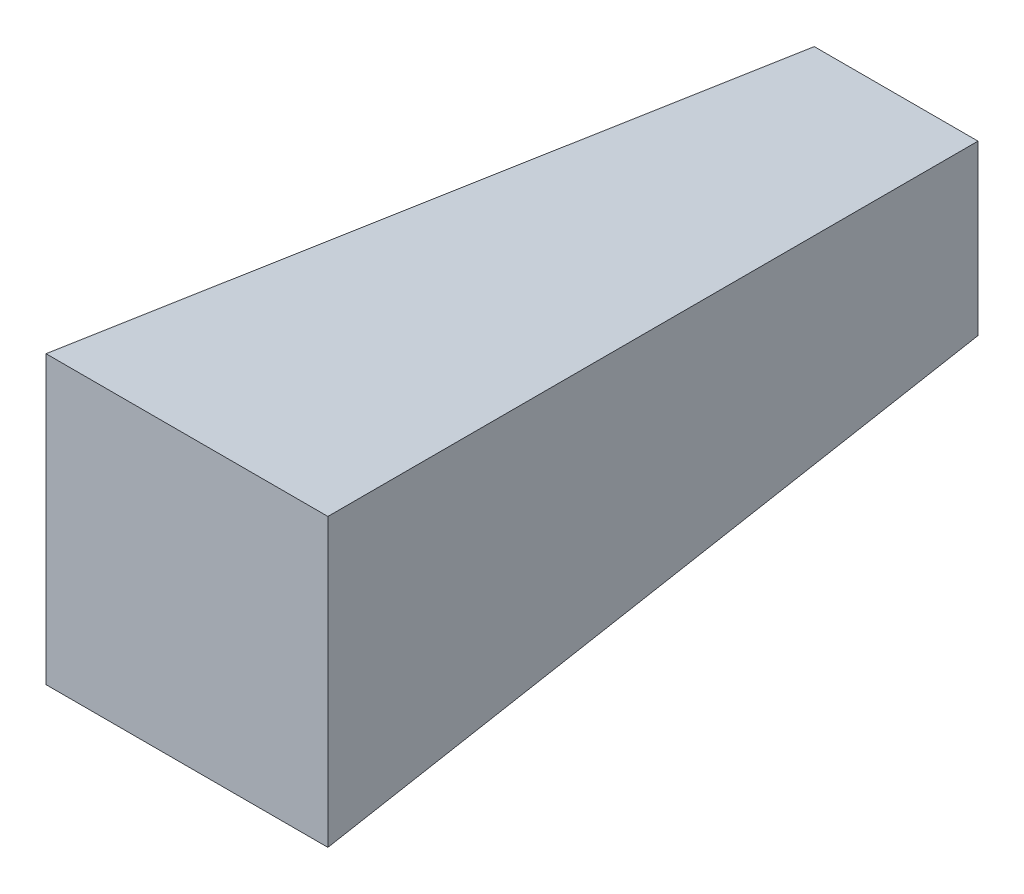
ISO-10303-21;
HEADER;
FILE_DESCRIPTION(('STEP AP214'),'2;1');
FILE_NAME('part.step','',(''),(''),'','','');
FILE_SCHEMA(('AUTOMOTIVE_DESIGN { 1 0 10303 214 1 1 1 1 }'));
ENDSEC;
DATA;
#1=APPLICATION_CONTEXT('core data for automotive mechanical design processes');
#2=APPLICATION_PROTOCOL_DEFINITION('international standard','automotive_design',2000,#1);
#3=PRODUCT_CONTEXT('',#1,'mechanical');
#4=PRODUCT('Part','Part','',(#3));
#5=PRODUCT_RELATED_PRODUCT_CATEGORY('part','',(#4));
#6=PRODUCT_DEFINITION_FORMATION('','',#4);
#7=PRODUCT_DEFINITION_CONTEXT('part definition',#1,'design');
#8=PRODUCT_DEFINITION('design','',#6,#7);
#9=PRODUCT_DEFINITION_SHAPE('','',#8);
#10=(LENGTH_UNIT() NAMED_UNIT(*) SI_UNIT(.MILLI.,.METRE.));
#11=(NAMED_UNIT(*) PLANE_ANGLE_UNIT() SI_UNIT($,.RADIAN.));
#12=(NAMED_UNIT(*) SI_UNIT($,.STERADIAN.) SOLID_ANGLE_UNIT());
#13=UNCERTAINTY_MEASURE_WITH_UNIT(LENGTH_MEASURE(1.E-05),#10,'distance_accuracy_value','');
#14=(GEOMETRIC_REPRESENTATION_CONTEXT(3) GLOBAL_UNCERTAINTY_ASSIGNED_CONTEXT((#13)) GLOBAL_UNIT_ASSIGNED_CONTEXT((#10,
#11,#12)) REPRESENTATION_CONTEXT('',''));
#15=CARTESIAN_POINT('',(0.,0.,0.));
#16=DIRECTION('',(0.,0.,1.));
#17=DIRECTION('',(1.,0.,0.));
#18=AXIS2_PLACEMENT_3D('',#15,#16,#17);
#19=CARTESIAN_POINT('',(0.,0.,0.));
#20=DIRECTION('',(0.,0.,-1.));
#21=DIRECTION('',(-1.,0.,0.));
#22=AXIS2_PLACEMENT_3D('',#19,#20,#21);
#23=PLANE('',#22);
#24=DIRECTION('',(0.,-1.,0.));
#25=VECTOR('',#24,1.);
#26=CARTESIAN_POINT('',(0.,0.,0.));
#27=LINE('',#26,#25);
#28=CARTESIAN_POINT('',(0.,142.477931937173,1.11022302462516E-13));
#29=VERTEX_POINT('',#28);
#30=CARTESIAN_POINT('',(0.,0.,0.));
#31=VERTEX_POINT('',#30);
#32=EDGE_CURVE('E183',#29,#31,#27,.T.);
#33=ORIENTED_EDGE('',*,*,#32,.F.);
#34=DIRECTION('',(-1.,0.,0.));
#35=VECTOR('',#34,1.);
#36=CARTESIAN_POINT('',(0.,142.477931937173,0.));
#37=LINE('',#36,#35);
#38=CARTESIAN_POINT('',(138.49,142.477931937173,0.));
#39=VERTEX_POINT('',#38);
#40=EDGE_CURVE('E178',#39,#29,#37,.T.);
#41=ORIENTED_EDGE('',*,*,#40,.F.);
#42=DIRECTION('',(0.,1.,0.));
#43=VECTOR('',#42,1.);
#44=CARTESIAN_POINT('',(138.49,0.,0.));
#45=LINE('',#44,#43);
#46=CARTESIAN_POINT('',(138.49,0.,0.));
#47=VERTEX_POINT('',#46);
#48=EDGE_CURVE('E53',#47,#39,#45,.T.);
#49=ORIENTED_EDGE('',*,*,#48,.F.);
#50=DIRECTION('',(1.,0.,0.));
#51=VECTOR('',#50,1.);
#52=CARTESIAN_POINT('',(0.,0.,0.));
#53=LINE('',#52,#51);
#54=EDGE_CURVE('E12',#31,#47,#53,.T.);
#55=ORIENTED_EDGE('',*,*,#54,.F.);
#56=EDGE_LOOP('',(#33,#41,#49,#55));
#57=FACE_BOUND('',#56,.T.);
#58=ADVANCED_FACE('F43',(#57),#23,.T.);
#59=CARTESIAN_POINT('',(0.,0.,600.));
#60=DIRECTION('',(0.,0.,1.));
#61=DIRECTION('',(1.,0.,0.));
#62=AXIS2_PLACEMENT_3D('',#59,#60,#61);
#63=PLANE('',#62);
#64=DIRECTION('',(-1.,0.,0.));
#65=VECTOR('',#64,1.);
#66=CARTESIAN_POINT('',(188.49,192.477931937173,600.));
#67=LINE('',#66,#65);
#68=CARTESIAN_POINT('',(188.49,192.477931937173,600.));
#69=VERTEX_POINT('',#68);
#70=CARTESIAN_POINT('',(-50.,192.477931937173,600.));
#71=VERTEX_POINT('',#70);
#72=EDGE_CURVE('E150',#69,#71,#67,.T.);
#73=ORIENTED_EDGE('',*,*,#72,.T.);
#74=DIRECTION('',(0.,-1.,0.));
#75=VECTOR('',#74,1.);
#76=CARTESIAN_POINT('',(-50.,192.477931937173,600.));
#77=LINE('',#76,#75);
#78=CARTESIAN_POINT('',(-50.,-50.,600.));
#79=VERTEX_POINT('',#78);
#80=EDGE_CURVE('E110',#71,#79,#77,.T.);
#81=ORIENTED_EDGE('',*,*,#80,.T.);
#82=DIRECTION('',(1.,0.,0.));
#83=VECTOR('',#82,1.);
#84=CARTESIAN_POINT('',(-50.,-50.,600.));
#85=LINE('',#84,#83);
#86=CARTESIAN_POINT('',(188.49,-50.,600.));
#87=VERTEX_POINT('',#86);
#88=EDGE_CURVE('E88',#79,#87,#85,.T.);
#89=ORIENTED_EDGE('',*,*,#88,.T.);
#90=DIRECTION('',(0.,1.,0.));
#91=VECTOR('',#90,1.);
#92=CARTESIAN_POINT('',(188.49,-50.,600.));
#93=LINE('',#92,#91);
#94=EDGE_CURVE('E96',#87,#69,#93,.T.);
#95=ORIENTED_EDGE('',*,*,#94,.T.);
#96=EDGE_LOOP('',(#73,#81,#89,#95));
#97=FACE_BOUND('',#96,.T.);
#98=ADVANCED_FACE('F109',(#97),#63,.T.);
#99=CARTESIAN_POINT('',(0.,141.49532551002,-11.791277125835));
#100=DIRECTION('',(0.,0.99654575824488,-0.08304547985374));
#101=DIRECTION('',(0.,0.08304547985374,0.99654575824488));
#102=AXIS2_PLACEMENT_3D('',#99,#100,#101);
#103=PLANE('',#102);
#104=DIRECTION('',(-0.0827605888602368,-0.0827605888602368,-0.993127066322842));
#105=VECTOR('',#104,1.);
#106=CARTESIAN_POINT('',(188.49,192.477931937173,600.));
#107=LINE('',#106,#105);
#108=EDGE_CURVE('E100',#69,#39,#107,.T.);
#109=ORIENTED_EDGE('',*,*,#108,.T.);
#110=ORIENTED_EDGE('',*,*,#40,.T.);
#111=DIRECTION('',(0.0827605888602368,-0.0827605888602368,-0.993127066322842));
#112=VECTOR('',#111,1.);
#113=CARTESIAN_POINT('',(-50.,192.477931937173,600.));
#114=LINE('',#113,#112);
#115=EDGE_CURVE('E93',#71,#29,#114,.T.);
#116=ORIENTED_EDGE('',*,*,#115,.F.);
#117=ORIENTED_EDGE('',*,*,#72,.F.);
#118=EDGE_LOOP('',(#109,#110,#116,#117));
#119=FACE_BOUND('',#118,.T.);
#120=ADVANCED_FACE('F129',(#119),#103,.T.);
#121=CARTESIAN_POINT('',(0.,0.,0.));
#122=DIRECTION('',(-0.99654575824488,0.,-0.08304547985374));
#123=DIRECTION('',(-0.08304547985374,0.,0.99654575824488));
#124=AXIS2_PLACEMENT_3D('',#121,#122,#123);
#125=PLANE('',#124);
#126=ORIENTED_EDGE('',*,*,#115,.T.);
#127=ORIENTED_EDGE('',*,*,#32,.T.);
#128=DIRECTION('',(0.0827605888602368,0.0827605888602368,-0.993127066322842));
#129=VECTOR('',#128,1.);
#130=CARTESIAN_POINT('',(-50.,-50.,600.));
#131=LINE('',#130,#129);
#132=EDGE_CURVE('E92',#79,#31,#131,.T.);
#133=ORIENTED_EDGE('',*,*,#132,.F.);
#134=ORIENTED_EDGE('',*,*,#80,.F.);
#135=EDGE_LOOP('',(#126,#127,#133,#134));
#136=FACE_BOUND('',#135,.T.);
#137=ADVANCED_FACE('F210',(#136),#125,.T.);
#138=CARTESIAN_POINT('',(137.534896551724,0.,-11.4612413793103));
#139=DIRECTION('',(0.99654575824488,0.,-0.08304547985374));
#140=DIRECTION('',(-0.08304547985374,0.,-0.99654575824488));
#141=AXIS2_PLACEMENT_3D('',#138,#139,#140);
#142=PLANE('',#141);
#143=DIRECTION('',(-0.0827605888602368,0.0827605888602368,-0.993127066322842));
#144=VECTOR('',#143,1.);
#145=CARTESIAN_POINT('',(188.49,-50.,600.));
#146=LINE('',#145,#144);
#147=EDGE_CURVE('E61',#87,#47,#146,.T.);
#148=ORIENTED_EDGE('',*,*,#147,.T.);
#149=ORIENTED_EDGE('',*,*,#48,.T.);
#150=ORIENTED_EDGE('',*,*,#108,.F.);
#151=ORIENTED_EDGE('',*,*,#94,.F.);
#152=EDGE_LOOP('',(#148,#149,#150,#151));
#153=FACE_BOUND('',#152,.T.);
#154=ADVANCED_FACE('F98',(#153),#142,.T.);
#155=CARTESIAN_POINT('',(0.,0.,0.));
#156=DIRECTION('',(0.,-0.99654575824488,-0.08304547985374));
#157=DIRECTION('',(0.,0.08304547985374,-0.99654575824488));
#158=AXIS2_PLACEMENT_3D('',#155,#156,#157);
#159=PLANE('',#158);
#160=ORIENTED_EDGE('',*,*,#132,.T.);
#161=ORIENTED_EDGE('',*,*,#54,.T.);
#162=ORIENTED_EDGE('',*,*,#147,.F.);
#163=ORIENTED_EDGE('',*,*,#88,.F.);
#164=EDGE_LOOP('',(#160,#161,#162,#163));
#165=FACE_BOUND('',#164,.T.);
#166=ADVANCED_FACE('F86',(#165),#159,.T.);
#167=CLOSED_SHELL('',(#58,#98,#120,#137,#154,#166));
#168=MANIFOLD_SOLID_BREP('B2',#167);
#169=ADVANCED_BREP_SHAPE_REPRESENTATION('',(#18,#168),#14);
#170=SHAPE_DEFINITION_REPRESENTATION(#9,#169);
ENDSEC;
END-ISO-10303-21;
